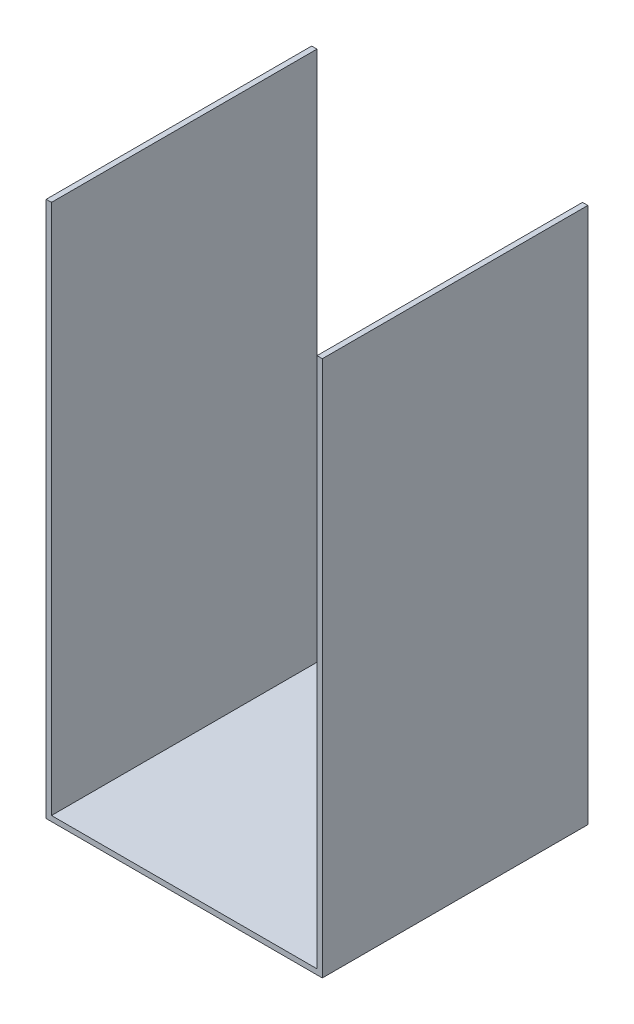
ISO-10303-21;
HEADER;
FILE_DESCRIPTION(('STEP AP214'),'2;1');
FILE_NAME('part.step','',(''),(''),'','','');
FILE_SCHEMA(('AUTOMOTIVE_DESIGN { 1 0 10303 214 1 1 1 1 }'));
ENDSEC;
DATA;
#1=APPLICATION_CONTEXT('core data for automotive mechanical design processes');
#2=APPLICATION_PROTOCOL_DEFINITION('international standard','automotive_design',2000,#1);
#3=PRODUCT_CONTEXT('',#1,'mechanical');
#4=PRODUCT('Part','Part','',(#3));
#5=PRODUCT_RELATED_PRODUCT_CATEGORY('part','',(#4));
#6=PRODUCT_DEFINITION_FORMATION('','',#4);
#7=PRODUCT_DEFINITION_CONTEXT('part definition',#1,'design');
#8=PRODUCT_DEFINITION('design','',#6,#7);
#9=PRODUCT_DEFINITION_SHAPE('','',#8);
#10=(LENGTH_UNIT() NAMED_UNIT(*) SI_UNIT(.MILLI.,.METRE.));
#11=(NAMED_UNIT(*) PLANE_ANGLE_UNIT() SI_UNIT($,.RADIAN.));
#12=(NAMED_UNIT(*) SI_UNIT($,.STERADIAN.) SOLID_ANGLE_UNIT());
#13=UNCERTAINTY_MEASURE_WITH_UNIT(LENGTH_MEASURE(1.E-05),#10,'distance_accuracy_value','');
#14=(GEOMETRIC_REPRESENTATION_CONTEXT(3) GLOBAL_UNCERTAINTY_ASSIGNED_CONTEXT((#13)) GLOBAL_UNIT_ASSIGNED_CONTEXT((#10,
#11,#12)) REPRESENTATION_CONTEXT('',''));
#15=CARTESIAN_POINT('',(0.,0.,0.));
#16=DIRECTION('',(0.,0.,1.));
#17=DIRECTION('',(1.,0.,0.));
#18=AXIS2_PLACEMENT_3D('',#15,#16,#17);
#19=CARTESIAN_POINT('',(-200.,0.,-10000.));
#20=DIRECTION('',(0.,1.,0.));
#21=DIRECTION('',(0.,0.,1.));
#22=AXIS2_PLACEMENT_3D('',#19,#20,#21);
#23=PLANE('',#22);
#24=DIRECTION('',(-1.,0.,0.));
#25=VECTOR('',#24,1.);
#26=CARTESIAN_POINT('',(-200.,0.,0.));
#27=LINE('',#26,#25);
#28=CARTESIAN_POINT('',(0.,0.,0.));
#29=VERTEX_POINT('',#28);
#30=CARTESIAN_POINT('',(-200.,0.,0.));
#31=VERTEX_POINT('',#30);
#32=EDGE_CURVE('E146',#29,#31,#27,.T.);
#33=ORIENTED_EDGE('',*,*,#32,.F.);
#34=DIRECTION('',(0.,0.,1.));
#35=VECTOR('',#34,1.);
#36=CARTESIAN_POINT('',(0.,0.,-10000.));
#37=LINE('',#36,#35);
#38=CARTESIAN_POINT('',(0.,0.,-10000.));
#39=VERTEX_POINT('',#38);
#40=EDGE_CURVE('E11',#39,#29,#37,.T.);
#41=ORIENTED_EDGE('',*,*,#40,.F.);
#42=DIRECTION('',(-1.,0.,0.));
#43=VECTOR('',#42,1.);
#44=CARTESIAN_POINT('',(-200.,0.,-10000.));
#45=LINE('',#44,#43);
#46=CARTESIAN_POINT('',(-200.,0.,-10000.));
#47=VERTEX_POINT('',#46);
#48=EDGE_CURVE('E174',#39,#47,#45,.T.);
#49=ORIENTED_EDGE('',*,*,#48,.T.);
#50=DIRECTION('',(0.,0.,1.));
#51=VECTOR('',#50,1.);
#52=CARTESIAN_POINT('',(-200.,0.,-10000.));
#53=LINE('',#52,#51);
#54=EDGE_CURVE('E46',#47,#31,#53,.T.);
#55=ORIENTED_EDGE('',*,*,#54,.T.);
#56=EDGE_LOOP('',(#33,#41,#49,#55));
#57=FACE_BOUND('',#56,.T.);
#58=ADVANCED_FACE('F43',(#57),#23,.T.);
#59=CARTESIAN_POINT('',(0.,0.,-10000.));
#60=DIRECTION('',(1.,0.,0.));
#61=DIRECTION('',(0.,1.,0.));
#62=AXIS2_PLACEMENT_3D('',#59,#60,#61);
#63=PLANE('',#62);
#64=DIRECTION('',(0.,1.,0.));
#65=VECTOR('',#64,1.);
#66=CARTESIAN_POINT('',(0.,0.,0.));
#67=LINE('',#66,#65);
#68=CARTESIAN_POINT('',(2.44929359829471E-12,-20000.,0.));
#69=VERTEX_POINT('',#68);
#70=EDGE_CURVE('E171',#69,#29,#67,.T.);
#71=ORIENTED_EDGE('',*,*,#70,.F.);
#72=DIRECTION('',(0.,0.,1.));
#73=VECTOR('',#72,1.);
#74=CARTESIAN_POINT('',(2.44929359829471E-12,-20000.,-10000.));
#75=LINE('',#74,#73);
#76=CARTESIAN_POINT('',(2.44929359829471E-12,-20000.,-10000.));
#77=VERTEX_POINT('',#76);
#78=EDGE_CURVE('E53',#77,#69,#75,.T.);
#79=ORIENTED_EDGE('',*,*,#78,.F.);
#80=DIRECTION('',(0.,1.,0.));
#81=VECTOR('',#80,1.);
#82=CARTESIAN_POINT('',(0.,0.,-10000.));
#83=LINE('',#82,#81);
#84=EDGE_CURVE('E132',#77,#39,#83,.T.);
#85=ORIENTED_EDGE('',*,*,#84,.T.);
#86=ORIENTED_EDGE('',*,*,#40,.T.);
#87=EDGE_LOOP('',(#71,#79,#85,#86));
#88=FACE_BOUND('',#87,.T.);
#89=ADVANCED_FACE('F192',(#88),#63,.T.);
#90=CARTESIAN_POINT('',(2.44929359829471E-12,-20000.,-10000.));
#91=DIRECTION('',(0.,1.,0.));
#92=DIRECTION('',(0.,0.,1.));
#93=AXIS2_PLACEMENT_3D('',#90,#91,#92);
#94=PLANE('',#93);
#95=DIRECTION('',(-1.,0.,0.));
#96=VECTOR('',#95,1.);
#97=CARTESIAN_POINT('',(2.44929359829471E-12,-20000.,0.));
#98=LINE('',#97,#96);
#99=CARTESIAN_POINT('',(10000.,-20000.,0.));
#100=VERTEX_POINT('',#99);
#101=EDGE_CURVE('E118',#100,#69,#98,.T.);
#102=ORIENTED_EDGE('',*,*,#101,.F.);
#103=DIRECTION('',(0.,0.,1.));
#104=VECTOR('',#103,1.);
#105=CARTESIAN_POINT('',(10000.,-20000.,-10000.));
#106=LINE('',#105,#104);
#107=CARTESIAN_POINT('',(10000.,-20000.,-10000.));
#108=VERTEX_POINT('',#107);
#109=EDGE_CURVE('E113',#108,#100,#106,.T.);
#110=ORIENTED_EDGE('',*,*,#109,.F.);
#111=DIRECTION('',(-1.,0.,0.));
#112=VECTOR('',#111,1.);
#113=CARTESIAN_POINT('',(2.44929359829471E-12,-20000.,-10000.));
#114=LINE('',#113,#112);
#115=EDGE_CURVE('E116',#108,#77,#114,.T.);
#116=ORIENTED_EDGE('',*,*,#115,.T.);
#117=ORIENTED_EDGE('',*,*,#78,.T.);
#118=EDGE_LOOP('',(#102,#110,#116,#117));
#119=FACE_BOUND('',#118,.T.);
#120=ADVANCED_FACE('F115',(#119),#94,.T.);
#121=CARTESIAN_POINT('',(10000.,-20000.,-10000.));
#122=DIRECTION('',(-1.,0.,0.));
#123=DIRECTION('',(0.,0.,1.));
#124=AXIS2_PLACEMENT_3D('',#121,#122,#123);
#125=PLANE('',#124);
#126=DIRECTION('',(0.,-1.,0.));
#127=VECTOR('',#126,1.);
#128=CARTESIAN_POINT('',(10000.,-20000.,0.));
#129=LINE('',#128,#127);
#130=CARTESIAN_POINT('',(10000.,0.,0.));
#131=VERTEX_POINT('',#130);
#132=EDGE_CURVE('E166',#131,#100,#129,.T.);
#133=ORIENTED_EDGE('',*,*,#132,.F.);
#134=DIRECTION('',(0.,0.,1.));
#135=VECTOR('',#134,1.);
#136=CARTESIAN_POINT('',(10000.,0.,-10000.));
#137=LINE('',#136,#135);
#138=CARTESIAN_POINT('',(10000.,0.,-10000.));
#139=VERTEX_POINT('',#138);
#140=EDGE_CURVE('E124',#139,#131,#137,.T.);
#141=ORIENTED_EDGE('',*,*,#140,.F.);
#142=DIRECTION('',(0.,-1.,0.));
#143=VECTOR('',#142,1.);
#144=CARTESIAN_POINT('',(10000.,-20000.,-10000.));
#145=LINE('',#144,#143);
#146=EDGE_CURVE('E130',#139,#108,#145,.T.);
#147=ORIENTED_EDGE('',*,*,#146,.T.);
#148=ORIENTED_EDGE('',*,*,#109,.T.);
#149=EDGE_LOOP('',(#133,#141,#147,#148));
#150=FACE_BOUND('',#149,.T.);
#151=ADVANCED_FACE('F135',(#150),#125,.T.);
#152=CARTESIAN_POINT('',(10000.,0.,-10000.));
#153=DIRECTION('',(0.,1.,0.));
#154=DIRECTION('',(0.,0.,1.));
#155=AXIS2_PLACEMENT_3D('',#152,#153,#154);
#156=PLANE('',#155);
#157=DIRECTION('',(-1.,0.,0.));
#158=VECTOR('',#157,1.);
#159=CARTESIAN_POINT('',(10000.,0.,0.));
#160=LINE('',#159,#158);
#161=CARTESIAN_POINT('',(10200.,0.,0.));
#162=VERTEX_POINT('',#161);
#163=EDGE_CURVE('E162',#162,#131,#160,.T.);
#164=ORIENTED_EDGE('',*,*,#163,.F.);
#165=DIRECTION('',(0.,0.,1.));
#166=VECTOR('',#165,1.);
#167=CARTESIAN_POINT('',(10200.,0.,-10000.));
#168=LINE('',#167,#166);
#169=CARTESIAN_POINT('',(10200.,0.,-10000.));
#170=VERTEX_POINT('',#169);
#171=EDGE_CURVE('E180',#170,#162,#168,.T.);
#172=ORIENTED_EDGE('',*,*,#171,.F.);
#173=DIRECTION('',(-1.,0.,0.));
#174=VECTOR('',#173,1.);
#175=CARTESIAN_POINT('',(10000.,0.,-10000.));
#176=LINE('',#175,#174);
#177=EDGE_CURVE('E137',#170,#139,#176,.T.);
#178=ORIENTED_EDGE('',*,*,#177,.T.);
#179=ORIENTED_EDGE('',*,*,#140,.T.);
#180=EDGE_LOOP('',(#164,#172,#178,#179));
#181=FACE_BOUND('',#180,.T.);
#182=ADVANCED_FACE('F205',(#181),#156,.T.);
#183=CARTESIAN_POINT('',(10200.,-20200.,-10000.));
#184=DIRECTION('',(1.,0.,0.));
#185=DIRECTION('',(0.,0.,-1.));
#186=AXIS2_PLACEMENT_3D('',#183,#184,#185);
#187=PLANE('',#186);
#188=DIRECTION('',(0.,1.,0.));
#189=VECTOR('',#188,1.);
#190=CARTESIAN_POINT('',(10200.,-20200.,0.));
#191=LINE('',#190,#189);
#192=CARTESIAN_POINT('',(10200.,-20200.,0.));
#193=VERTEX_POINT('',#192);
#194=EDGE_CURVE('E158',#193,#162,#191,.T.);
#195=ORIENTED_EDGE('',*,*,#194,.F.);
#196=DIRECTION('',(0.,0.,1.));
#197=VECTOR('',#196,1.);
#198=CARTESIAN_POINT('',(10200.,-20200.,-10000.));
#199=LINE('',#198,#197);
#200=CARTESIAN_POINT('',(10200.,-20200.,-10000.));
#201=VERTEX_POINT('',#200);
#202=EDGE_CURVE('E183',#201,#193,#199,.T.);
#203=ORIENTED_EDGE('',*,*,#202,.F.);
#204=DIRECTION('',(0.,1.,0.));
#205=VECTOR('',#204,1.);
#206=CARTESIAN_POINT('',(10200.,-20200.,-10000.));
#207=LINE('',#206,#205);
#208=EDGE_CURVE('E140',#201,#170,#207,.T.);
#209=ORIENTED_EDGE('',*,*,#208,.T.);
#210=ORIENTED_EDGE('',*,*,#171,.T.);
#211=EDGE_LOOP('',(#195,#203,#209,#210));
#212=FACE_BOUND('',#211,.T.);
#213=ADVANCED_FACE('F208',(#212),#187,.T.);
#214=CARTESIAN_POINT('',(-199.999999999997,-20200.,-10000.));
#215=DIRECTION('',(0.,-1.,0.));
#216=DIRECTION('',(0.,0.,-1.));
#217=AXIS2_PLACEMENT_3D('',#214,#215,#216);
#218=PLANE('',#217);
#219=DIRECTION('',(1.,0.,0.));
#220=VECTOR('',#219,1.);
#221=CARTESIAN_POINT('',(-199.999999999997,-20200.,0.));
#222=LINE('',#221,#220);
#223=CARTESIAN_POINT('',(-199.999999999997,-20200.,0.));
#224=VERTEX_POINT('',#223);
#225=EDGE_CURVE('E154',#224,#193,#222,.T.);
#226=ORIENTED_EDGE('',*,*,#225,.F.);
#227=DIRECTION('',(0.,0.,1.));
#228=VECTOR('',#227,1.);
#229=CARTESIAN_POINT('',(-199.999999999997,-20200.,-10000.));
#230=LINE('',#229,#228);
#231=CARTESIAN_POINT('',(-199.999999999997,-20200.,-10000.));
#232=VERTEX_POINT('',#231);
#233=EDGE_CURVE('E185',#232,#224,#230,.T.);
#234=ORIENTED_EDGE('',*,*,#233,.F.);
#235=DIRECTION('',(1.,0.,0.));
#236=VECTOR('',#235,1.);
#237=CARTESIAN_POINT('',(-199.999999999997,-20200.,-10000.));
#238=LINE('',#237,#236);
#239=EDGE_CURVE('E303',#232,#201,#238,.T.);
#240=ORIENTED_EDGE('',*,*,#239,.T.);
#241=ORIENTED_EDGE('',*,*,#202,.T.);
#242=EDGE_LOOP('',(#226,#234,#240,#241));
#243=FACE_BOUND('',#242,.T.);
#244=ADVANCED_FACE('F212',(#243),#218,.T.);
#245=CARTESIAN_POINT('',(-200.,0.,-10000.));
#246=DIRECTION('',(-1.,0.,0.));
#247=DIRECTION('',(0.,-1.,0.));
#248=AXIS2_PLACEMENT_3D('',#245,#246,#247);
#249=PLANE('',#248);
#250=DIRECTION('',(0.,-1.,0.));
#251=VECTOR('',#250,1.);
#252=CARTESIAN_POINT('',(-200.,0.,0.));
#253=LINE('',#252,#251);
#254=EDGE_CURVE('E150',#31,#224,#253,.T.);
#255=ORIENTED_EDGE('',*,*,#254,.F.);
#256=ORIENTED_EDGE('',*,*,#54,.F.);
#257=DIRECTION('',(0.,-1.,0.));
#258=VECTOR('',#257,1.);
#259=CARTESIAN_POINT('',(-200.,0.,-10000.));
#260=LINE('',#259,#258);
#261=EDGE_CURVE('E306',#47,#232,#260,.T.);
#262=ORIENTED_EDGE('',*,*,#261,.T.);
#263=ORIENTED_EDGE('',*,*,#233,.T.);
#264=EDGE_LOOP('',(#255,#256,#262,#263));
#265=FACE_BOUND('',#264,.T.);
#266=ADVANCED_FACE('F189',(#265),#249,.T.);
#267=CARTESIAN_POINT('',(0.,0.,-10000.));
#268=DIRECTION('',(0.,0.,-1.));
#269=DIRECTION('',(-1.,0.,0.));
#270=AXIS2_PLACEMENT_3D('',#267,#268,#269);
#271=PLANE('',#270);
#272=ORIENTED_EDGE('',*,*,#48,.F.);
#273=ORIENTED_EDGE('',*,*,#84,.F.);
#274=ORIENTED_EDGE('',*,*,#115,.F.);
#275=ORIENTED_EDGE('',*,*,#146,.F.);
#276=ORIENTED_EDGE('',*,*,#177,.F.);
#277=ORIENTED_EDGE('',*,*,#208,.F.);
#278=ORIENTED_EDGE('',*,*,#239,.F.);
#279=ORIENTED_EDGE('',*,*,#261,.F.);
#280=EDGE_LOOP('',(#272,#273,#274,#275,#276,#277,#278,#279));
#281=FACE_BOUND('',#280,.T.);
#282=ADVANCED_FACE('F128',(#281),#271,.T.);
#283=CARTESIAN_POINT('',(0.,0.,0.));
#284=DIRECTION('',(0.,0.,-1.));
#285=DIRECTION('',(-1.,0.,0.));
#286=AXIS2_PLACEMENT_3D('',#283,#284,#285);
#287=PLANE('',#286);
#288=ORIENTED_EDGE('',*,*,#32,.T.);
#289=ORIENTED_EDGE('',*,*,#254,.T.);
#290=ORIENTED_EDGE('',*,*,#225,.T.);
#291=ORIENTED_EDGE('',*,*,#194,.T.);
#292=ORIENTED_EDGE('',*,*,#163,.T.);
#293=ORIENTED_EDGE('',*,*,#132,.T.);
#294=ORIENTED_EDGE('',*,*,#101,.T.);
#295=ORIENTED_EDGE('',*,*,#70,.T.);
#296=EDGE_LOOP('',(#288,#289,#290,#291,#292,#293,#294,#295));
#297=FACE_BOUND('',#296,.T.);
#298=ADVANCED_FACE('F191',(#297),#287,.F.);
#299=CLOSED_SHELL('',(#58,#89,#120,#151,#182,#213,#244,#266,#282,#298));
#300=MANIFOLD_SOLID_BREP('B2',#299);
#301=ADVANCED_BREP_SHAPE_REPRESENTATION('',(#18,#300),#14);
#302=SHAPE_DEFINITION_REPRESENTATION(#9,#301);
ENDSEC;
END-ISO-10303-21;
